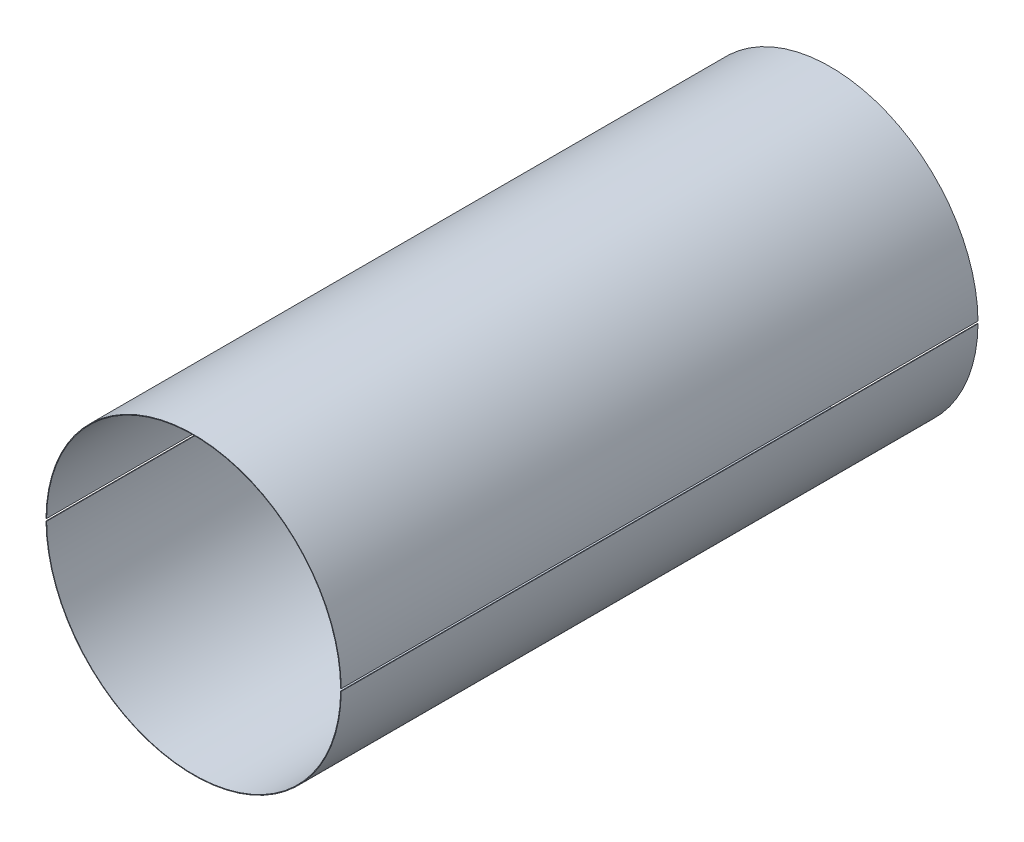
ISO-10303-21;
HEADER;
FILE_DESCRIPTION(('STEP AP214'),'2;1');
FILE_NAME('part.step','',(''),(''),'','','');
FILE_SCHEMA(('AUTOMOTIVE_DESIGN { 1 0 10303 214 1 1 1 1 }'));
ENDSEC;
DATA;
#1=APPLICATION_CONTEXT('core data for automotive mechanical design processes');
#2=APPLICATION_PROTOCOL_DEFINITION('international standard','automotive_design',2000,#1);
#3=PRODUCT_CONTEXT('',#1,'mechanical');
#4=PRODUCT('Part','Part','',(#3));
#5=PRODUCT_RELATED_PRODUCT_CATEGORY('part','',(#4));
#6=PRODUCT_DEFINITION_FORMATION('','',#4);
#7=PRODUCT_DEFINITION_CONTEXT('part definition',#1,'design');
#8=PRODUCT_DEFINITION('design','',#6,#7);
#9=PRODUCT_DEFINITION_SHAPE('','',#8);
#10=(LENGTH_UNIT() NAMED_UNIT(*) SI_UNIT(.MILLI.,.METRE.));
#11=(NAMED_UNIT(*) PLANE_ANGLE_UNIT() SI_UNIT($,.RADIAN.));
#12=(NAMED_UNIT(*) SI_UNIT($,.STERADIAN.) SOLID_ANGLE_UNIT());
#13=UNCERTAINTY_MEASURE_WITH_UNIT(LENGTH_MEASURE(1.E-05),#10,'distance_accuracy_value','');
#14=(GEOMETRIC_REPRESENTATION_CONTEXT(3) GLOBAL_UNCERTAINTY_ASSIGNED_CONTEXT((#13)) GLOBAL_UNIT_ASSIGNED_CONTEXT((#10,
#11,#12)) REPRESENTATION_CONTEXT('',''));
#15=CARTESIAN_POINT('',(0.,0.,0.));
#16=DIRECTION('',(0.,0.,1.));
#17=DIRECTION('',(1.,0.,0.));
#18=AXIS2_PLACEMENT_3D('',#15,#16,#17);
#19=CARTESIAN_POINT('',(0.,0.,279.4));
#20=DIRECTION('',(0.,0.,1.));
#21=DIRECTION('',(1.,0.,0.));
#22=AXIS2_PLACEMENT_3D('',#19,#20,#21);
#23=PLANE('',#22);
#24=DIRECTION('',(-1.,0.,0.));
#25=VECTOR('',#24,1.);
#26=CARTESIAN_POINT('',(64.77,0.507999999999995,279.4));
#27=LINE('',#26,#25);
#28=CARTESIAN_POINT('',(64.7680078124995,0.507999999999995,279.4));
#29=VERTEX_POINT('',#28);
#30=CARTESIAN_POINT('',(64.513999968999,0.507999999999995,279.4));
#31=VERTEX_POINT('',#30);
#32=EDGE_CURVE('E51',#29,#31,#27,.T.);
#33=ORIENTED_EDGE('',*,*,#32,.F.);
#34=CARTESIAN_POINT('',(0.,0.,279.4));
#35=DIRECTION('',(0.,0.,1.));
#36=DIRECTION('',(1.,0.,0.));
#37=AXIS2_PLACEMENT_3D('',#34,#35,#36);
#38=CIRCLE('',#37,64.77);
#39=CARTESIAN_POINT('',(-64.7680078124995,0.507999999999995,279.4));
#40=VERTEX_POINT('',#39);
#41=EDGE_CURVE('E106',#29,#40,#38,.T.);
#42=ORIENTED_EDGE('',*,*,#41,.T.);
#43=CARTESIAN_POINT('',(-64.513999968999,0.507999999999995,279.4));
#44=VERTEX_POINT('',#43);
#45=EDGE_CURVE('E88',#44,#40,#27,.T.);
#46=ORIENTED_EDGE('',*,*,#45,.F.);
#47=CARTESIAN_POINT('',(0.,0.,279.4));
#48=DIRECTION('',(0.,0.,1.));
#49=DIRECTION('',(1.,0.,0.));
#50=AXIS2_PLACEMENT_3D('',#47,#48,#49);
#51=CIRCLE('',#50,64.516);
#52=EDGE_CURVE('E93',#31,#44,#51,.T.);
#53=ORIENTED_EDGE('',*,*,#52,.F.);
#54=EDGE_LOOP('',(#33,#42,#46,#53));
#55=FACE_BOUND('',#54,.T.);
#56=ADVANCED_FACE('F43',(#55),#23,.T.);
#57=CARTESIAN_POINT('',(0.,0.,0.));
#58=DIRECTION('',(0.,0.,1.));
#59=DIRECTION('',(1.,0.,0.));
#60=AXIS2_PLACEMENT_3D('',#57,#58,#59);
#61=PLANE('',#60);
#62=CARTESIAN_POINT('',(0.,0.,0.));
#63=DIRECTION('',(0.,0.,1.));
#64=DIRECTION('',(1.,0.,0.));
#65=AXIS2_PLACEMENT_3D('',#62,#63,#64);
#66=CIRCLE('',#65,64.77);
#67=CARTESIAN_POINT('',(64.7680078124995,0.508000000000002,0.));
#68=VERTEX_POINT('',#67);
#69=CARTESIAN_POINT('',(-64.7680078124995,0.508000000000002,0.));
#70=VERTEX_POINT('',#69);
#71=EDGE_CURVE('E94',#68,#70,#66,.T.);
#72=ORIENTED_EDGE('',*,*,#71,.F.);
#73=DIRECTION('',(-1.,0.,0.));
#74=VECTOR('',#73,1.);
#75=CARTESIAN_POINT('',(64.77,0.508000000000002,0.));
#76=LINE('',#75,#74);
#77=CARTESIAN_POINT('',(64.513999968999,0.508000000000002,0.));
#78=VERTEX_POINT('',#77);
#79=EDGE_CURVE('E64',#68,#78,#76,.T.);
#80=ORIENTED_EDGE('',*,*,#79,.T.);
#81=CARTESIAN_POINT('',(0.,0.,0.));
#82=DIRECTION('',(0.,0.,1.));
#83=DIRECTION('',(1.,0.,0.));
#84=AXIS2_PLACEMENT_3D('',#81,#82,#83);
#85=CIRCLE('',#84,64.516);
#86=CARTESIAN_POINT('',(-64.513999968999,0.507999999999995,0.));
#87=VERTEX_POINT('',#86);
#88=EDGE_CURVE('E46',#78,#87,#85,.T.);
#89=ORIENTED_EDGE('',*,*,#88,.T.);
#90=EDGE_CURVE('E83',#87,#70,#76,.T.);
#91=ORIENTED_EDGE('',*,*,#90,.T.);
#92=EDGE_LOOP('',(#72,#80,#89,#91));
#93=FACE_BOUND('',#92,.T.);
#94=ADVANCED_FACE('F99',(#93),#61,.F.);
#95=CARTESIAN_POINT('',(0.,0.,279.4));
#96=DIRECTION('',(0.,0.,-1.));
#97=DIRECTION('',(-1.,0.,0.));
#98=AXIS2_PLACEMENT_3D('',#95,#96,#97);
#99=CYLINDRICAL_SURFACE('',#98,64.77);
#100=ORIENTED_EDGE('',*,*,#41,.F.);
#101=DIRECTION('',(0.,0.,-1.));
#102=VECTOR('',#101,1.);
#103=CARTESIAN_POINT('',(64.7680078124995,0.507999999999995,279.4));
#104=LINE('',#103,#102);
#105=EDGE_CURVE('E59',#29,#68,#104,.T.);
#106=ORIENTED_EDGE('',*,*,#105,.T.);
#107=ORIENTED_EDGE('',*,*,#71,.T.);
#108=DIRECTION('',(0.,0.,-1.));
#109=VECTOR('',#108,1.);
#110=CARTESIAN_POINT('',(-64.7680078124995,0.507999999999995,279.4));
#111=LINE('',#110,#109);
#112=EDGE_CURVE('E86',#70,#40,#111,.F.);
#113=ORIENTED_EDGE('',*,*,#112,.T.);
#114=EDGE_LOOP('',(#100,#106,#107,#113));
#115=FACE_BOUND('',#114,.T.);
#116=ADVANCED_FACE('F102',(#115),#99,.T.);
#117=CARTESIAN_POINT('',(0.,0.,279.4));
#118=DIRECTION('',(0.,0.,-1.));
#119=DIRECTION('',(-1.,0.,0.));
#120=AXIS2_PLACEMENT_3D('',#117,#118,#119);
#121=CYLINDRICAL_SURFACE('',#120,64.516);
#122=DIRECTION('',(0.,0.,-1.));
#123=VECTOR('',#122,1.);
#124=CARTESIAN_POINT('',(64.513999968999,0.507999999999995,279.4));
#125=LINE('',#124,#123);
#126=EDGE_CURVE('E12',#31,#78,#125,.T.);
#127=ORIENTED_EDGE('',*,*,#126,.F.);
#128=ORIENTED_EDGE('',*,*,#52,.T.);
#129=DIRECTION('',(0.,0.,-1.));
#130=VECTOR('',#129,1.);
#131=CARTESIAN_POINT('',(-64.513999968999,0.507999999999995,279.4));
#132=LINE('',#131,#130);
#133=EDGE_CURVE('E78',#87,#44,#132,.F.);
#134=ORIENTED_EDGE('',*,*,#133,.F.);
#135=ORIENTED_EDGE('',*,*,#88,.F.);
#136=EDGE_LOOP('',(#127,#128,#134,#135));
#137=FACE_BOUND('',#136,.T.);
#138=ADVANCED_FACE('F115',(#137),#121,.F.);
#139=CARTESIAN_POINT('',(64.77,0.508000000000002,0.));
#140=DIRECTION('',(0.,1.,0.));
#141=DIRECTION('',(0.,0.,1.));
#142=AXIS2_PLACEMENT_3D('',#139,#140,#141);
#143=PLANE('',#142);
#144=ORIENTED_EDGE('',*,*,#90,.F.);
#145=ORIENTED_EDGE('',*,*,#133,.T.);
#146=ORIENTED_EDGE('',*,*,#45,.T.);
#147=ORIENTED_EDGE('',*,*,#112,.F.);
#148=EDGE_LOOP('',(#144,#145,#146,#147));
#149=FACE_BOUND('',#148,.T.);
#150=ADVANCED_FACE('F87',(#149),#143,.F.);
#151=ORIENTED_EDGE('',*,*,#32,.T.);
#152=ORIENTED_EDGE('',*,*,#126,.T.);
#153=ORIENTED_EDGE('',*,*,#79,.F.);
#154=ORIENTED_EDGE('',*,*,#105,.F.);
#155=EDGE_LOOP('',(#151,#152,#153,#154));
#156=FACE_BOUND('',#155,.T.);
#157=ADVANCED_FACE('F113',(#156),#143,.F.);
#158=CLOSED_SHELL('',(#56,#94,#116,#138,#150,#157));
#159=MANIFOLD_SOLID_BREP('B2',#158);
#160=CARTESIAN_POINT('',(0.,0.,279.4));
#161=DIRECTION('',(0.,0.,-1.));
#162=DIRECTION('',(-1.,0.,0.));
#163=AXIS2_PLACEMENT_3D('',#160,#161,#162);
#164=CYLINDRICAL_SURFACE('',#163,64.516);
#165=DIRECTION('',(0.,0.,-1.));
#166=VECTOR('',#165,1.);
#167=CARTESIAN_POINT('',(-64.513999968999,-0.507999999999995,279.4));
#168=LINE('',#167,#166);
#169=CARTESIAN_POINT('',(-64.513999968999,-0.507999999999995,279.4));
#170=VERTEX_POINT('',#169);
#171=CARTESIAN_POINT('',(-64.513999968999,-0.508000000000002,0.));
#172=VERTEX_POINT('',#171);
#173=EDGE_CURVE('E41',#170,#172,#168,.T.);
#174=ORIENTED_EDGE('',*,*,#173,.F.);
#175=CARTESIAN_POINT('',(0.,0.,279.4));
#176=DIRECTION('',(0.,0.,1.));
#177=DIRECTION('',(1.,0.,0.));
#178=AXIS2_PLACEMENT_3D('',#175,#176,#177);
#179=CIRCLE('',#178,64.516);
#180=CARTESIAN_POINT('',(64.513999968999,-0.507999999999995,279.4));
#181=VERTEX_POINT('',#180);
#182=EDGE_CURVE('E222',#170,#181,#179,.T.);
#183=ORIENTED_EDGE('',*,*,#182,.T.);
#184=DIRECTION('',(0.,0.,-1.));
#185=VECTOR('',#184,1.);
#186=CARTESIAN_POINT('',(64.513999968999,-0.507999999999995,279.4));
#187=LINE('',#186,#185);
#188=CARTESIAN_POINT('',(64.513999968999,-0.507999999999995,0.));
#189=VERTEX_POINT('',#188);
#190=EDGE_CURVE('E172',#189,#181,#187,.F.);
#191=ORIENTED_EDGE('',*,*,#190,.F.);
#192=CARTESIAN_POINT('',(0.,0.,0.));
#193=DIRECTION('',(0.,0.,1.));
#194=DIRECTION('',(1.,0.,0.));
#195=AXIS2_PLACEMENT_3D('',#192,#193,#194);
#196=CIRCLE('',#195,64.516);
#197=EDGE_CURVE('E225',#172,#189,#196,.T.);
#198=ORIENTED_EDGE('',*,*,#197,.F.);
#199=EDGE_LOOP('',(#174,#183,#191,#198));
#200=FACE_BOUND('',#199,.T.);
#201=ADVANCED_FACE('F164',(#200),#164,.F.);
#202=CARTESIAN_POINT('',(0.,0.,279.4));
#203=DIRECTION('',(0.,0.,-1.));
#204=DIRECTION('',(-1.,0.,0.));
#205=AXIS2_PLACEMENT_3D('',#202,#203,#204);
#206=CYLINDRICAL_SURFACE('',#205,64.77);
#207=CARTESIAN_POINT('',(0.,0.,279.4));
#208=DIRECTION('',(0.,0.,1.));
#209=DIRECTION('',(1.,0.,0.));
#210=AXIS2_PLACEMENT_3D('',#207,#208,#209);
#211=CIRCLE('',#210,64.77);
#212=CARTESIAN_POINT('',(-64.7680078124995,-0.507999999999995,279.4));
#213=VERTEX_POINT('',#212);
#214=CARTESIAN_POINT('',(64.7680078124995,-0.507999999999995,279.4));
#215=VERTEX_POINT('',#214);
#216=EDGE_CURVE('E215',#213,#215,#211,.T.);
#217=ORIENTED_EDGE('',*,*,#216,.F.);
#218=DIRECTION('',(0.,0.,-1.));
#219=VECTOR('',#218,1.);
#220=CARTESIAN_POINT('',(-64.7680078124995,-0.507999999999995,279.4));
#221=LINE('',#220,#219);
#222=CARTESIAN_POINT('',(-64.7680078124995,-0.508000000000002,0.));
#223=VERTEX_POINT('',#222);
#224=EDGE_CURVE('E218',#213,#223,#221,.T.);
#225=ORIENTED_EDGE('',*,*,#224,.T.);
#226=CARTESIAN_POINT('',(0.,0.,0.));
#227=DIRECTION('',(0.,0.,1.));
#228=DIRECTION('',(1.,0.,0.));
#229=AXIS2_PLACEMENT_3D('',#226,#227,#228);
#230=CIRCLE('',#229,64.77);
#231=CARTESIAN_POINT('',(64.7680078124995,-0.508000000000002,0.));
#232=VERTEX_POINT('',#231);
#233=EDGE_CURVE('E217',#223,#232,#230,.T.);
#234=ORIENTED_EDGE('',*,*,#233,.T.);
#235=DIRECTION('',(0.,0.,-1.));
#236=VECTOR('',#235,1.);
#237=CARTESIAN_POINT('',(64.7680078124995,-0.507999999999995,279.4));
#238=LINE('',#237,#236);
#239=EDGE_CURVE('E205',#232,#215,#238,.F.);
#240=ORIENTED_EDGE('',*,*,#239,.T.);
#241=EDGE_LOOP('',(#217,#225,#234,#240));
#242=FACE_BOUND('',#241,.T.);
#243=ADVANCED_FACE('F166',(#242),#206,.T.);
#244=CARTESIAN_POINT('',(0.,0.,0.));
#245=DIRECTION('',(0.,0.,1.));
#246=DIRECTION('',(1.,0.,0.));
#247=AXIS2_PLACEMENT_3D('',#244,#245,#246);
#248=PLANE('',#247);
#249=ORIENTED_EDGE('',*,*,#233,.F.);
#250=DIRECTION('',(-1.,0.,0.));
#251=VECTOR('',#250,1.);
#252=CARTESIAN_POINT('',(64.77,-0.508000000000002,0.));
#253=LINE('',#252,#251);
#254=EDGE_CURVE('E230',#172,#223,#253,.T.);
#255=ORIENTED_EDGE('',*,*,#254,.F.);
#256=ORIENTED_EDGE('',*,*,#197,.T.);
#257=EDGE_CURVE('E179',#232,#189,#253,.T.);
#258=ORIENTED_EDGE('',*,*,#257,.F.);
#259=EDGE_LOOP('',(#249,#255,#256,#258));
#260=FACE_BOUND('',#259,.T.);
#261=ADVANCED_FACE('F235',(#260),#248,.F.);
#262=CARTESIAN_POINT('',(0.,0.,279.4));
#263=DIRECTION('',(0.,0.,1.));
#264=DIRECTION('',(1.,0.,0.));
#265=AXIS2_PLACEMENT_3D('',#262,#263,#264);
#266=PLANE('',#265);
#267=DIRECTION('',(-1.,0.,0.));
#268=VECTOR('',#267,1.);
#269=CARTESIAN_POINT('',(64.77,-0.507999999999995,279.4));
#270=LINE('',#269,#268);
#271=EDGE_CURVE('E186',#170,#213,#270,.T.);
#272=ORIENTED_EDGE('',*,*,#271,.T.);
#273=ORIENTED_EDGE('',*,*,#216,.T.);
#274=EDGE_CURVE('E202',#215,#181,#270,.T.);
#275=ORIENTED_EDGE('',*,*,#274,.T.);
#276=ORIENTED_EDGE('',*,*,#182,.F.);
#277=EDGE_LOOP('',(#272,#273,#275,#276));
#278=FACE_BOUND('',#277,.T.);
#279=ADVANCED_FACE('F220',(#278),#266,.T.);
#280=CARTESIAN_POINT('',(64.77,-0.508000000000002,0.));
#281=DIRECTION('',(0.,-1.,0.));
#282=DIRECTION('',(0.,0.,-1.));
#283=AXIS2_PLACEMENT_3D('',#280,#281,#282);
#284=PLANE('',#283);
#285=ORIENTED_EDGE('',*,*,#257,.T.);
#286=ORIENTED_EDGE('',*,*,#190,.T.);
#287=ORIENTED_EDGE('',*,*,#274,.F.);
#288=ORIENTED_EDGE('',*,*,#239,.F.);
#289=EDGE_LOOP('',(#285,#286,#287,#288));
#290=FACE_BOUND('',#289,.T.);
#291=ADVANCED_FACE('F204',(#290),#284,.F.);
#292=ORIENTED_EDGE('',*,*,#271,.F.);
#293=ORIENTED_EDGE('',*,*,#173,.T.);
#294=ORIENTED_EDGE('',*,*,#254,.T.);
#295=ORIENTED_EDGE('',*,*,#224,.F.);
#296=EDGE_LOOP('',(#292,#293,#294,#295));
#297=FACE_BOUND('',#296,.T.);
#298=ADVANCED_FACE('F232',(#297),#284,.F.);
#299=CLOSED_SHELL('',(#201,#243,#261,#279,#291,#298));
#300=MANIFOLD_SOLID_BREP('B6',#299);
#301=ADVANCED_BREP_SHAPE_REPRESENTATION('',(#18,#159,#300),#14);
#302=SHAPE_DEFINITION_REPRESENTATION(#9,#301);
ENDSEC;
END-ISO-10303-21;
